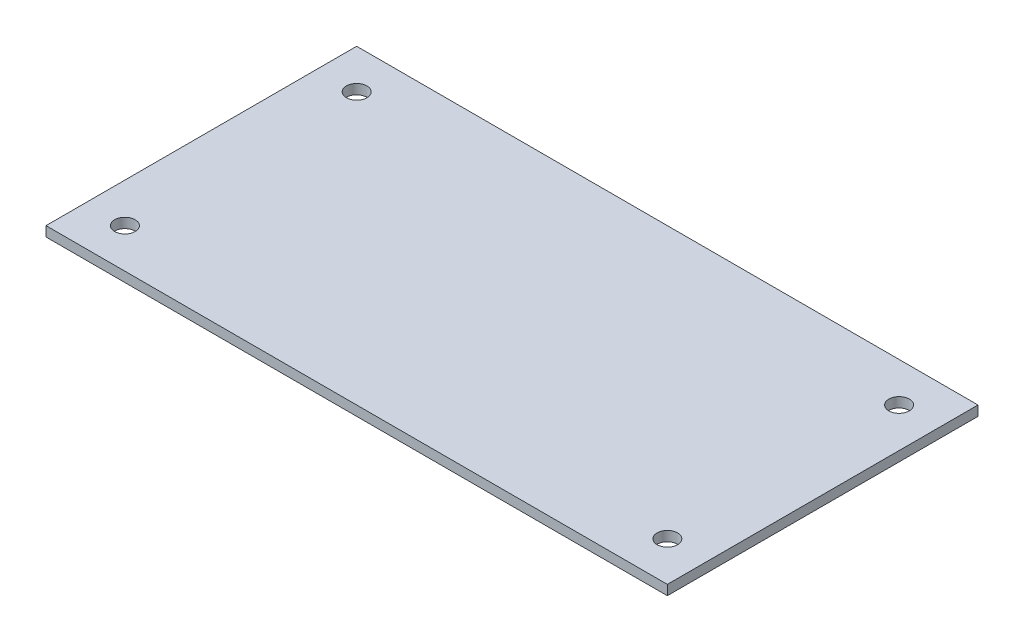
ISO-10303-21;
HEADER;
FILE_DESCRIPTION(('STEP AP214'),'2;1');
FILE_NAME('part.step','',(''),(''),'','','');
FILE_SCHEMA(('AUTOMOTIVE_DESIGN { 1 0 10303 214 1 1 1 1 }'));
ENDSEC;
DATA;
#1=APPLICATION_CONTEXT('core data for automotive mechanical design processes');
#2=APPLICATION_PROTOCOL_DEFINITION('international standard','automotive_design',2000,#1);
#3=PRODUCT_CONTEXT('',#1,'mechanical');
#4=PRODUCT('Part','Part','',(#3));
#5=PRODUCT_RELATED_PRODUCT_CATEGORY('part','',(#4));
#6=PRODUCT_DEFINITION_FORMATION('','',#4);
#7=PRODUCT_DEFINITION_CONTEXT('part definition',#1,'design');
#8=PRODUCT_DEFINITION('design','',#6,#7);
#9=PRODUCT_DEFINITION_SHAPE('','',#8);
#10=(LENGTH_UNIT() NAMED_UNIT(*) SI_UNIT(.MILLI.,.METRE.));
#11=(NAMED_UNIT(*) PLANE_ANGLE_UNIT() SI_UNIT($,.RADIAN.));
#12=(NAMED_UNIT(*) SI_UNIT($,.STERADIAN.) SOLID_ANGLE_UNIT());
#13=UNCERTAINTY_MEASURE_WITH_UNIT(LENGTH_MEASURE(1.E-05),#10,'distance_accuracy_value','');
#14=(GEOMETRIC_REPRESENTATION_CONTEXT(3) GLOBAL_UNCERTAINTY_ASSIGNED_CONTEXT((#13)) GLOBAL_UNIT_ASSIGNED_CONTEXT((#10,
#11,#12)) REPRESENTATION_CONTEXT('',''));
#15=CARTESIAN_POINT('',(0.,0.,0.));
#16=DIRECTION('',(0.,0.,1.));
#17=DIRECTION('',(1.,0.,0.));
#18=AXIS2_PLACEMENT_3D('',#15,#16,#17);
#19=CARTESIAN_POINT('',(100.,-3.175,50.));
#20=DIRECTION('',(1.,0.,0.));
#21=DIRECTION('',(0.,0.,-1.));
#22=AXIS2_PLACEMENT_3D('',#19,#20,#21);
#23=PLANE('',#22);
#24=DIRECTION('',(0.,0.,-1.));
#25=VECTOR('',#24,1.);
#26=CARTESIAN_POINT('',(100.,0.,50.));
#27=LINE('',#26,#25);
#28=CARTESIAN_POINT('',(100.,0.,50.));
#29=VERTEX_POINT('',#28);
#30=CARTESIAN_POINT('',(100.,0.,-50.));
#31=VERTEX_POINT('',#30);
#32=EDGE_CURVE('E106',#29,#31,#27,.T.);
#33=ORIENTED_EDGE('',*,*,#32,.F.);
#34=DIRECTION('',(0.,1.,0.));
#35=VECTOR('',#34,1.);
#36=CARTESIAN_POINT('',(100.,-3.175,50.));
#37=LINE('',#36,#35);
#38=CARTESIAN_POINT('',(100.,-3.175,50.));
#39=VERTEX_POINT('',#38);
#40=EDGE_CURVE('E11',#39,#29,#37,.T.);
#41=ORIENTED_EDGE('',*,*,#40,.F.);
#42=DIRECTION('',(0.,0.,-1.));
#43=VECTOR('',#42,1.);
#44=CARTESIAN_POINT('',(100.,-3.175,50.));
#45=LINE('',#44,#43);
#46=CARTESIAN_POINT('',(100.,-3.175,-50.));
#47=VERTEX_POINT('',#46);
#48=EDGE_CURVE('E99',#39,#47,#45,.T.);
#49=ORIENTED_EDGE('',*,*,#48,.T.);
#50=DIRECTION('',(0.,1.,0.));
#51=VECTOR('',#50,1.);
#52=CARTESIAN_POINT('',(100.,-3.175,-50.));
#53=LINE('',#52,#51);
#54=EDGE_CURVE('E82',#47,#31,#53,.T.);
#55=ORIENTED_EDGE('',*,*,#54,.T.);
#56=EDGE_LOOP('',(#33,#41,#49,#55));
#57=FACE_BOUND('',#56,.T.);
#58=ADVANCED_FACE('F39',(#57),#23,.T.);
#59=CARTESIAN_POINT('',(-100.,-3.175,50.));
#60=DIRECTION('',(0.,0.,1.));
#61=DIRECTION('',(1.,0.,0.));
#62=AXIS2_PLACEMENT_3D('',#59,#60,#61);
#63=PLANE('',#62);
#64=DIRECTION('',(1.,0.,0.));
#65=VECTOR('',#64,1.);
#66=CARTESIAN_POINT('',(-100.,0.,50.));
#67=LINE('',#66,#65);
#68=CARTESIAN_POINT('',(-100.,0.,50.));
#69=VERTEX_POINT('',#68);
#70=EDGE_CURVE('E101',#69,#29,#67,.T.);
#71=ORIENTED_EDGE('',*,*,#70,.F.);
#72=DIRECTION('',(0.,1.,0.));
#73=VECTOR('',#72,1.);
#74=CARTESIAN_POINT('',(-100.,-3.175,50.));
#75=LINE('',#74,#73);
#76=CARTESIAN_POINT('',(-100.,-3.175,50.));
#77=VERTEX_POINT('',#76);
#78=EDGE_CURVE('E48',#77,#69,#75,.T.);
#79=ORIENTED_EDGE('',*,*,#78,.F.);
#80=DIRECTION('',(1.,0.,0.));
#81=VECTOR('',#80,1.);
#82=CARTESIAN_POINT('',(-100.,-3.175,50.));
#83=LINE('',#82,#81);
#84=EDGE_CURVE('E96',#77,#39,#83,.T.);
#85=ORIENTED_EDGE('',*,*,#84,.T.);
#86=ORIENTED_EDGE('',*,*,#40,.T.);
#87=EDGE_LOOP('',(#71,#79,#85,#86));
#88=FACE_BOUND('',#87,.T.);
#89=ADVANCED_FACE('F153',(#88),#63,.T.);
#90=CARTESIAN_POINT('',(-100.,-3.175,50.));
#91=DIRECTION('',(-1.,0.,0.));
#92=DIRECTION('',(0.,0.,1.));
#93=AXIS2_PLACEMENT_3D('',#90,#91,#92);
#94=PLANE('',#93);
#95=DIRECTION('',(0.,0.,1.));
#96=VECTOR('',#95,1.);
#97=CARTESIAN_POINT('',(-100.,0.,50.));
#98=LINE('',#97,#96);
#99=CARTESIAN_POINT('',(-100.,0.,-50.));
#100=VERTEX_POINT('',#99);
#101=EDGE_CURVE('E90',#100,#69,#98,.T.);
#102=ORIENTED_EDGE('',*,*,#101,.F.);
#103=DIRECTION('',(0.,1.,0.));
#104=VECTOR('',#103,1.);
#105=CARTESIAN_POINT('',(-100.,-3.175,-50.));
#106=LINE('',#105,#104);
#107=CARTESIAN_POINT('',(-100.,-3.175,-50.));
#108=VERTEX_POINT('',#107);
#109=EDGE_CURVE('E85',#108,#100,#106,.T.);
#110=ORIENTED_EDGE('',*,*,#109,.F.);
#111=DIRECTION('',(0.,0.,1.));
#112=VECTOR('',#111,1.);
#113=CARTESIAN_POINT('',(-100.,-3.175,50.));
#114=LINE('',#113,#112);
#115=EDGE_CURVE('E88',#108,#77,#114,.T.);
#116=ORIENTED_EDGE('',*,*,#115,.T.);
#117=ORIENTED_EDGE('',*,*,#78,.T.);
#118=EDGE_LOOP('',(#102,#110,#116,#117));
#119=FACE_BOUND('',#118,.T.);
#120=ADVANCED_FACE('F87',(#119),#94,.T.);
#121=CARTESIAN_POINT('',(-100.,-3.175,-50.));
#122=DIRECTION('',(0.,0.,-1.));
#123=DIRECTION('',(-1.,0.,0.));
#124=AXIS2_PLACEMENT_3D('',#121,#122,#123);
#125=PLANE('',#124);
#126=DIRECTION('',(-1.,0.,0.));
#127=VECTOR('',#126,1.);
#128=CARTESIAN_POINT('',(-100.,0.,-50.));
#129=LINE('',#128,#127);
#130=EDGE_CURVE('E109',#31,#100,#129,.T.);
#131=ORIENTED_EDGE('',*,*,#130,.F.);
#132=ORIENTED_EDGE('',*,*,#54,.F.);
#133=DIRECTION('',(-1.,0.,0.));
#134=VECTOR('',#133,1.);
#135=CARTESIAN_POINT('',(-100.,-3.175,-50.));
#136=LINE('',#135,#134);
#137=EDGE_CURVE('E95',#47,#108,#136,.T.);
#138=ORIENTED_EDGE('',*,*,#137,.T.);
#139=ORIENTED_EDGE('',*,*,#109,.T.);
#140=EDGE_LOOP('',(#131,#132,#138,#139));
#141=FACE_BOUND('',#140,.T.);
#142=ADVANCED_FACE('F98',(#141),#125,.T.);
#143=CARTESIAN_POINT('',(0.,-3.175,0.));
#144=DIRECTION('',(0.,-1.,0.));
#145=DIRECTION('',(0.,0.,-1.));
#146=AXIS2_PLACEMENT_3D('',#143,#144,#145);
#147=PLANE('',#146);
#148=CARTESIAN_POINT('',(-87.3,-3.175,37.3));
#149=DIRECTION('',(0.,-1.,0.));
#150=DIRECTION('',(0.,0.,-1.));
#151=AXIS2_PLACEMENT_3D('',#148,#149,#150);
#152=CIRCLE('',#151,3.3);
#153=CARTESIAN_POINT('',(-87.3,-3.175,34.));
#154=VERTEX_POINT('',#153);
#155=EDGE_CURVE('E134',#154,#154,#152,.T.);
#156=ORIENTED_EDGE('',*,*,#155,.F.);
#157=EDGE_LOOP('',(#156));
#158=FACE_BOUND('',#157,.T.);
#159=CARTESIAN_POINT('',(-87.3,-3.175,-37.3000000000001));
#160=DIRECTION('',(0.,-1.,0.));
#161=DIRECTION('',(0.,0.,-1.));
#162=AXIS2_PLACEMENT_3D('',#159,#160,#161);
#163=CIRCLE('',#162,3.3);
#164=CARTESIAN_POINT('',(-87.3,-3.175,-40.6000000000001));
#165=VERTEX_POINT('',#164);
#166=EDGE_CURVE('E128',#165,#165,#163,.T.);
#167=ORIENTED_EDGE('',*,*,#166,.F.);
#168=EDGE_LOOP('',(#167));
#169=FACE_BOUND('',#168,.T.);
#170=CARTESIAN_POINT('',(87.3,-3.175,-37.3));
#171=DIRECTION('',(0.,-1.,0.));
#172=DIRECTION('',(0.,0.,-1.));
#173=AXIS2_PLACEMENT_3D('',#170,#171,#172);
#174=CIRCLE('',#173,3.3);
#175=CARTESIAN_POINT('',(87.3,-3.175,-40.6));
#176=VERTEX_POINT('',#175);
#177=EDGE_CURVE('E42',#176,#176,#174,.T.);
#178=ORIENTED_EDGE('',*,*,#177,.F.);
#179=EDGE_LOOP('',(#178));
#180=FACE_BOUND('',#179,.T.);
#181=CARTESIAN_POINT('',(87.3,-3.175,37.3));
#182=DIRECTION('',(0.,-1.,0.));
#183=DIRECTION('',(0.,0.,-1.));
#184=AXIS2_PLACEMENT_3D('',#181,#182,#183);
#185=CIRCLE('',#184,3.3);
#186=CARTESIAN_POINT('',(87.3,-3.175,34.));
#187=VERTEX_POINT('',#186);
#188=EDGE_CURVE('E110',#187,#187,#185,.T.);
#189=ORIENTED_EDGE('',*,*,#188,.F.);
#190=EDGE_LOOP('',(#189));
#191=FACE_BOUND('',#190,.T.);
#192=ORIENTED_EDGE('',*,*,#48,.F.);
#193=ORIENTED_EDGE('',*,*,#84,.F.);
#194=ORIENTED_EDGE('',*,*,#115,.F.);
#195=ORIENTED_EDGE('',*,*,#137,.F.);
#196=EDGE_LOOP('',(#192,#193,#194,#195));
#197=FACE_BOUND('',#196,.T.);
#198=ADVANCED_FACE('F94',(#158,#169,#180,#191,#197),#147,.T.);
#199=CARTESIAN_POINT('',(0.,0.,0.));
#200=DIRECTION('',(0.,-1.,0.));
#201=DIRECTION('',(0.,0.,-1.));
#202=AXIS2_PLACEMENT_3D('',#199,#200,#201);
#203=PLANE('',#202);
#204=CARTESIAN_POINT('',(-87.3,0.,37.3));
#205=DIRECTION('',(0.,1.,0.));
#206=DIRECTION('',(0.,0.,1.));
#207=AXIS2_PLACEMENT_3D('',#204,#205,#206);
#208=CIRCLE('',#207,3.3);
#209=CARTESIAN_POINT('',(-87.3,0.,40.6));
#210=VERTEX_POINT('',#209);
#211=EDGE_CURVE('E137',#210,#210,#208,.T.);
#212=ORIENTED_EDGE('',*,*,#211,.F.);
#213=EDGE_LOOP('',(#212));
#214=FACE_BOUND('',#213,.T.);
#215=CARTESIAN_POINT('',(-87.3,0.,-37.3000000000001));
#216=DIRECTION('',(0.,1.,0.));
#217=DIRECTION('',(0.,0.,1.));
#218=AXIS2_PLACEMENT_3D('',#215,#216,#217);
#219=CIRCLE('',#218,3.3);
#220=CARTESIAN_POINT('',(-87.3,0.,-34.0000000000001));
#221=VERTEX_POINT('',#220);
#222=EDGE_CURVE('E131',#221,#221,#219,.T.);
#223=ORIENTED_EDGE('',*,*,#222,.F.);
#224=EDGE_LOOP('',(#223));
#225=FACE_BOUND('',#224,.T.);
#226=CARTESIAN_POINT('',(87.3,0.,-37.3));
#227=DIRECTION('',(0.,1.,0.));
#228=DIRECTION('',(0.,0.,1.));
#229=AXIS2_PLACEMENT_3D('',#226,#227,#228);
#230=CIRCLE('',#229,3.3);
#231=CARTESIAN_POINT('',(87.3,0.,-34.));
#232=VERTEX_POINT('',#231);
#233=EDGE_CURVE('E124',#232,#232,#230,.T.);
#234=ORIENTED_EDGE('',*,*,#233,.F.);
#235=EDGE_LOOP('',(#234));
#236=FACE_BOUND('',#235,.T.);
#237=CARTESIAN_POINT('',(87.3,0.,37.3));
#238=DIRECTION('',(0.,1.,0.));
#239=DIRECTION('',(0.,0.,1.));
#240=AXIS2_PLACEMENT_3D('',#237,#238,#239);
#241=CIRCLE('',#240,3.3);
#242=CARTESIAN_POINT('',(87.3,0.,40.6));
#243=VERTEX_POINT('',#242);
#244=EDGE_CURVE('E117',#243,#243,#241,.T.);
#245=ORIENTED_EDGE('',*,*,#244,.F.);
#246=EDGE_LOOP('',(#245));
#247=FACE_BOUND('',#246,.T.);
#248=ORIENTED_EDGE('',*,*,#32,.T.);
#249=ORIENTED_EDGE('',*,*,#130,.T.);
#250=ORIENTED_EDGE('',*,*,#101,.T.);
#251=ORIENTED_EDGE('',*,*,#70,.T.);
#252=EDGE_LOOP('',(#248,#249,#250,#251));
#253=FACE_BOUND('',#252,.T.);
#254=ADVANCED_FACE('F143',(#214,#225,#236,#247,#253),#203,.F.);
#255=CARTESIAN_POINT('',(87.3,0.,37.3));
#256=DIRECTION('',(0.,1.,0.));
#257=DIRECTION('',(0.,0.,1.));
#258=AXIS2_PLACEMENT_3D('',#255,#256,#257);
#259=CYLINDRICAL_SURFACE('',#258,3.3);
#260=ORIENTED_EDGE('',*,*,#188,.T.);
#261=EDGE_LOOP('',(#260));
#262=FACE_BOUND('',#261,.T.);
#263=ORIENTED_EDGE('',*,*,#244,.T.);
#264=EDGE_LOOP('',(#263));
#265=FACE_BOUND('',#264,.T.);
#266=ADVANCED_FACE('F146',(#262,#265),#259,.F.);
#267=CARTESIAN_POINT('',(87.3,0.,-37.3));
#268=DIRECTION('',(0.,1.,0.));
#269=DIRECTION('',(0.,0.,1.));
#270=AXIS2_PLACEMENT_3D('',#267,#268,#269);
#271=CYLINDRICAL_SURFACE('',#270,3.3);
#272=ORIENTED_EDGE('',*,*,#177,.T.);
#273=EDGE_LOOP('',(#272));
#274=FACE_BOUND('',#273,.T.);
#275=ORIENTED_EDGE('',*,*,#233,.T.);
#276=EDGE_LOOP('',(#275));
#277=FACE_BOUND('',#276,.T.);
#278=ADVANCED_FACE('F174',(#274,#277),#271,.F.);
#279=CARTESIAN_POINT('',(-87.3,0.,-37.3000000000001));
#280=DIRECTION('',(0.,1.,0.));
#281=DIRECTION('',(0.,0.,1.));
#282=AXIS2_PLACEMENT_3D('',#279,#280,#281);
#283=CYLINDRICAL_SURFACE('',#282,3.3);
#284=ORIENTED_EDGE('',*,*,#166,.T.);
#285=EDGE_LOOP('',(#284));
#286=FACE_BOUND('',#285,.T.);
#287=ORIENTED_EDGE('',*,*,#222,.T.);
#288=EDGE_LOOP('',(#287));
#289=FACE_BOUND('',#288,.T.);
#290=ADVANCED_FACE('F177',(#286,#289),#283,.F.);
#291=CARTESIAN_POINT('',(-87.3,0.,37.3));
#292=DIRECTION('',(0.,1.,0.));
#293=DIRECTION('',(0.,0.,1.));
#294=AXIS2_PLACEMENT_3D('',#291,#292,#293);
#295=CYLINDRICAL_SURFACE('',#294,3.3);
#296=ORIENTED_EDGE('',*,*,#155,.T.);
#297=EDGE_LOOP('',(#296));
#298=FACE_BOUND('',#297,.T.);
#299=ORIENTED_EDGE('',*,*,#211,.T.);
#300=EDGE_LOOP('',(#299));
#301=FACE_BOUND('',#300,.T.);
#302=ADVANCED_FACE('F141',(#298,#301),#295,.F.);
#303=CLOSED_SHELL('',(#58,#89,#120,#142,#198,#254,#266,#278,#290,#302));
#304=MANIFOLD_SOLID_BREP('B2',#303);
#305=ADVANCED_BREP_SHAPE_REPRESENTATION('',(#18,#304),#14);
#306=SHAPE_DEFINITION_REPRESENTATION(#9,#305);
ENDSEC;
END-ISO-10303-21;
